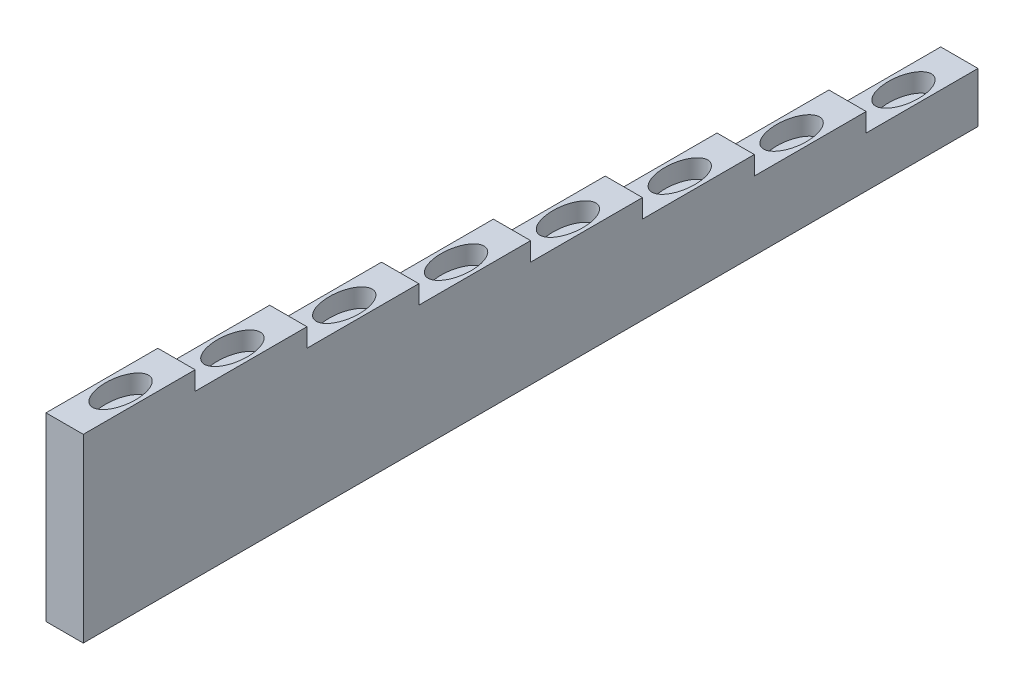
ISO-10303-21;
HEADER;
FILE_DESCRIPTION(('STEP AP214'),'2;1');
FILE_NAME('part.step','',(''),(''),'','','');
FILE_SCHEMA(('AUTOMOTIVE_DESIGN { 1 0 10303 214 1 1 1 1 }'));
ENDSEC;
DATA;
#1=APPLICATION_CONTEXT('core data for automotive mechanical design processes');
#2=APPLICATION_PROTOCOL_DEFINITION('international standard','automotive_design',2000,#1);
#3=PRODUCT_CONTEXT('',#1,'mechanical');
#4=PRODUCT('Part','Part','',(#3));
#5=PRODUCT_RELATED_PRODUCT_CATEGORY('part','',(#4));
#6=PRODUCT_DEFINITION_FORMATION('','',#4);
#7=PRODUCT_DEFINITION_CONTEXT('part definition',#1,'design');
#8=PRODUCT_DEFINITION('design','',#6,#7);
#9=PRODUCT_DEFINITION_SHAPE('','',#8);
#10=(LENGTH_UNIT() NAMED_UNIT(*) SI_UNIT(.MILLI.,.METRE.));
#11=(NAMED_UNIT(*) PLANE_ANGLE_UNIT() SI_UNIT($,.RADIAN.));
#12=(NAMED_UNIT(*) SI_UNIT($,.STERADIAN.) SOLID_ANGLE_UNIT());
#13=UNCERTAINTY_MEASURE_WITH_UNIT(LENGTH_MEASURE(1.E-05),#10,'distance_accuracy_value','');
#14=(GEOMETRIC_REPRESENTATION_CONTEXT(3) GLOBAL_UNCERTAINTY_ASSIGNED_CONTEXT((#13)) GLOBAL_UNIT_ASSIGNED_CONTEXT((#10,
#11,#12)) REPRESENTATION_CONTEXT('',''));
#15=CARTESIAN_POINT('',(0.,0.,0.));
#16=DIRECTION('',(0.,0.,1.));
#17=DIRECTION('',(1.,0.,0.));
#18=AXIS2_PLACEMENT_3D('',#15,#16,#17);
#19=CARTESIAN_POINT('',(-7.23,-34.,48.));
#20=DIRECTION('',(0.,1.,0.));
#21=DIRECTION('',(0.,0.,1.));
#22=AXIS2_PLACEMENT_3D('',#19,#20,#21);
#23=PLANE('',#22);
#24=DIRECTION('',(1.,0.,0.));
#25=VECTOR('',#24,1.);
#26=CARTESIAN_POINT('',(-7.23,-34.,0.));
#27=LINE('',#26,#25);
#28=CARTESIAN_POINT('',(-9.23,-34.,0.));
#29=VERTEX_POINT('',#28);
#30=CARTESIAN_POINT('',(-7.23,-34.,0.));
#31=VERTEX_POINT('',#30);
#32=EDGE_CURVE('E74',#29,#31,#27,.T.);
#33=ORIENTED_EDGE('',*,*,#32,.T.);
#34=DIRECTION('',(0.,0.,-1.));
#35=VECTOR('',#34,1.);
#36=CARTESIAN_POINT('',(-7.23,-34.,48.));
#37=LINE('',#36,#35);
#38=CARTESIAN_POINT('',(-7.23,-34.,48.));
#39=VERTEX_POINT('',#38);
#40=EDGE_CURVE('E43',#39,#31,#37,.T.);
#41=ORIENTED_EDGE('',*,*,#40,.F.);
#42=DIRECTION('',(1.,0.,0.));
#43=VECTOR('',#42,1.);
#44=CARTESIAN_POINT('',(-7.23,-34.,48.));
#45=LINE('',#44,#43);
#46=CARTESIAN_POINT('',(-9.23,-34.,48.));
#47=VERTEX_POINT('',#46);
#48=EDGE_CURVE('E86',#47,#39,#45,.T.);
#49=ORIENTED_EDGE('',*,*,#48,.F.);
#50=DIRECTION('',(0.,0.,-1.));
#51=VECTOR('',#50,1.);
#52=CARTESIAN_POINT('',(-9.23,-34.,48.));
#53=LINE('',#52,#51);
#54=EDGE_CURVE('E11',#47,#29,#53,.T.);
#55=ORIENTED_EDGE('',*,*,#54,.T.);
#56=EDGE_LOOP('',(#33,#41,#49,#55));
#57=FACE_BOUND('',#56,.T.);
#58=ADVANCED_FACE('F34',(#57),#23,.F.);
#59=CARTESIAN_POINT('',(0.,0.,0.));
#60=DIRECTION('',(0.,0.,-1.));
#61=DIRECTION('',(-1.,0.,0.));
#62=AXIS2_PLACEMENT_3D('',#59,#60,#61);
#63=PLANE('',#62);
#64=DIRECTION('',(1.,0.,0.));
#65=VECTOR('',#64,1.);
#66=CARTESIAN_POINT('',(-9.23,-31.3,0.));
#67=LINE('',#66,#65);
#68=CARTESIAN_POINT('',(-9.23,-31.3,0.));
#69=VERTEX_POINT('',#68);
#70=CARTESIAN_POINT('',(-7.23,-31.3,0.));
#71=VERTEX_POINT('',#70);
#72=EDGE_CURVE('E89',#69,#71,#67,.T.);
#73=ORIENTED_EDGE('',*,*,#72,.T.);
#74=DIRECTION('',(0.,1.,0.));
#75=VECTOR('',#74,1.);
#76=CARTESIAN_POINT('',(-7.23,-20.3,0.));
#77=LINE('',#76,#75);
#78=EDGE_CURVE('E80',#31,#71,#77,.T.);
#79=ORIENTED_EDGE('',*,*,#78,.F.);
#80=ORIENTED_EDGE('',*,*,#32,.F.);
#81=DIRECTION('',(0.,-1.,0.));
#82=VECTOR('',#81,1.);
#83=CARTESIAN_POINT('',(-9.23,-34.,0.));
#84=LINE('',#83,#82);
#85=EDGE_CURVE('E81',#69,#29,#84,.T.);
#86=ORIENTED_EDGE('',*,*,#85,.F.);
#87=EDGE_LOOP('',(#73,#79,#80,#86));
#88=FACE_BOUND('',#87,.T.);
#89=ADVANCED_FACE('F88',(#88),#63,.T.);
#90=CARTESIAN_POINT('',(0.,0.,48.));
#91=DIRECTION('',(0.,0.,-1.));
#92=DIRECTION('',(-1.,0.,0.));
#93=AXIS2_PLACEMENT_3D('',#90,#91,#92);
#94=PLANE('',#93);
#95=DIRECTION('',(0.,1.,0.));
#96=VECTOR('',#95,1.);
#97=CARTESIAN_POINT('',(-7.23000000000001,-2.00000000000001,48.));
#98=LINE('',#97,#96);
#99=CARTESIAN_POINT('',(-7.23,-24.3,48.));
#100=VERTEX_POINT('',#99);
#101=EDGE_CURVE('E60',#39,#100,#98,.T.);
#102=ORIENTED_EDGE('',*,*,#101,.T.);
#103=DIRECTION('',(1.,0.,0.));
#104=VECTOR('',#103,1.);
#105=CARTESIAN_POINT('',(-9.23,-24.3,48.));
#106=LINE('',#105,#104);
#107=CARTESIAN_POINT('',(-9.23,-24.3,48.));
#108=VERTEX_POINT('',#107);
#109=EDGE_CURVE('E575',#108,#100,#106,.T.);
#110=ORIENTED_EDGE('',*,*,#109,.F.);
#111=DIRECTION('',(0.,-1.,0.));
#112=VECTOR('',#111,1.);
#113=CARTESIAN_POINT('',(-9.23,-34.,48.));
#114=LINE('',#113,#112);
#115=EDGE_CURVE('E91',#108,#47,#114,.T.);
#116=ORIENTED_EDGE('',*,*,#115,.T.);
#117=ORIENTED_EDGE('',*,*,#48,.T.);
#118=EDGE_LOOP('',(#102,#110,#116,#117));
#119=FACE_BOUND('',#118,.T.);
#120=ADVANCED_FACE('F270',(#119),#94,.F.);
#121=CARTESIAN_POINT('',(-7.23,-20.3,48.));
#122=DIRECTION('',(-1.,0.,0.));
#123=DIRECTION('',(0.,-1.,0.));
#124=AXIS2_PLACEMENT_3D('',#121,#122,#123);
#125=PLANE('',#124);
#126=DIRECTION('',(0.,-1.,0.));
#127=VECTOR('',#126,1.);
#128=CARTESIAN_POINT('',(-7.23,-24.3,42.));
#129=LINE('',#128,#127);
#130=CARTESIAN_POINT('',(-7.23,-24.3,42.));
#131=VERTEX_POINT('',#130);
#132=CARTESIAN_POINT('',(-7.23,-25.3,42.));
#133=VERTEX_POINT('',#132);
#134=EDGE_CURVE('E566',#131,#133,#129,.T.);
#135=ORIENTED_EDGE('',*,*,#134,.F.);
#136=DIRECTION('',(0.,0.,-1.));
#137=VECTOR('',#136,1.);
#138=CARTESIAN_POINT('',(-7.23,-24.3,48.));
#139=LINE('',#138,#137);
#140=EDGE_CURVE('E563',#100,#131,#139,.T.);
#141=ORIENTED_EDGE('',*,*,#140,.F.);
#142=ORIENTED_EDGE('',*,*,#101,.F.);
#143=ORIENTED_EDGE('',*,*,#40,.T.);
#144=ORIENTED_EDGE('',*,*,#78,.T.);
#145=DIRECTION('',(0.,0.,-1.));
#146=VECTOR('',#145,1.);
#147=CARTESIAN_POINT('',(-7.23,-31.3,6.00000000000001));
#148=LINE('',#147,#146);
#149=CARTESIAN_POINT('',(-7.23,-31.3,6.00000000000001));
#150=VERTEX_POINT('',#149);
#151=EDGE_CURVE('E51',#150,#71,#148,.T.);
#152=ORIENTED_EDGE('',*,*,#151,.F.);
#153=DIRECTION('',(0.,-1.,0.));
#154=VECTOR('',#153,1.);
#155=CARTESIAN_POINT('',(-7.23,-30.3,6.00000000000001));
#156=LINE('',#155,#154);
#157=CARTESIAN_POINT('',(-7.23,-30.3,6.00000000000001));
#158=VERTEX_POINT('',#157);
#159=EDGE_CURVE('E559',#158,#150,#156,.T.);
#160=ORIENTED_EDGE('',*,*,#159,.F.);
#161=DIRECTION('',(0.,0.,-1.));
#162=VECTOR('',#161,1.);
#163=CARTESIAN_POINT('',(-7.23,-30.3,12.));
#164=LINE('',#163,#162);
#165=CARTESIAN_POINT('',(-7.23,-30.3,12.));
#166=VERTEX_POINT('',#165);
#167=EDGE_CURVE('E556',#166,#158,#164,.T.);
#168=ORIENTED_EDGE('',*,*,#167,.F.);
#169=DIRECTION('',(0.,-1.,0.));
#170=VECTOR('',#169,1.);
#171=CARTESIAN_POINT('',(-7.23,-29.3,12.));
#172=LINE('',#171,#170);
#173=CARTESIAN_POINT('',(-7.23,-29.3,12.));
#174=VERTEX_POINT('',#173);
#175=EDGE_CURVE('E550',#174,#166,#172,.T.);
#176=ORIENTED_EDGE('',*,*,#175,.F.);
#177=DIRECTION('',(0.,0.,-1.));
#178=VECTOR('',#177,1.);
#179=CARTESIAN_POINT('',(-7.23,-29.3,18.));
#180=LINE('',#179,#178);
#181=CARTESIAN_POINT('',(-7.23,-29.3,18.));
#182=VERTEX_POINT('',#181);
#183=EDGE_CURVE('E547',#182,#174,#180,.T.);
#184=ORIENTED_EDGE('',*,*,#183,.F.);
#185=DIRECTION('',(0.,-1.,0.));
#186=VECTOR('',#185,1.);
#187=CARTESIAN_POINT('',(-7.23,-28.3,18.));
#188=LINE('',#187,#186);
#189=CARTESIAN_POINT('',(-7.23,-28.3,18.));
#190=VERTEX_POINT('',#189);
#191=EDGE_CURVE('E540',#190,#182,#188,.T.);
#192=ORIENTED_EDGE('',*,*,#191,.F.);
#193=DIRECTION('',(0.,0.,-1.));
#194=VECTOR('',#193,1.);
#195=CARTESIAN_POINT('',(-7.23,-28.3,24.));
#196=LINE('',#195,#194);
#197=CARTESIAN_POINT('',(-7.23,-28.3,24.));
#198=VERTEX_POINT('',#197);
#199=EDGE_CURVE('E526',#198,#190,#196,.T.);
#200=ORIENTED_EDGE('',*,*,#199,.F.);
#201=DIRECTION('',(0.,-1.,0.));
#202=VECTOR('',#201,1.);
#203=CARTESIAN_POINT('',(-7.23,-27.3,24.));
#204=LINE('',#203,#202);
#205=CARTESIAN_POINT('',(-7.23,-27.3,24.));
#206=VERTEX_POINT('',#205);
#207=EDGE_CURVE('E541',#206,#198,#204,.T.);
#208=ORIENTED_EDGE('',*,*,#207,.F.);
#209=DIRECTION('',(0.,0.,-1.));
#210=VECTOR('',#209,1.);
#211=CARTESIAN_POINT('',(-7.23,-27.3,30.));
#212=LINE('',#211,#210);
#213=CARTESIAN_POINT('',(-7.23,-27.3,30.));
#214=VERTEX_POINT('',#213);
#215=EDGE_CURVE('E722',#214,#206,#212,.T.);
#216=ORIENTED_EDGE('',*,*,#215,.F.);
#217=DIRECTION('',(0.,-1.,0.));
#218=VECTOR('',#217,1.);
#219=CARTESIAN_POINT('',(-7.23,-26.3,30.));
#220=LINE('',#219,#218);
#221=CARTESIAN_POINT('',(-7.23,-26.3,30.));
#222=VERTEX_POINT('',#221);
#223=EDGE_CURVE('E719',#222,#214,#220,.T.);
#224=ORIENTED_EDGE('',*,*,#223,.F.);
#225=DIRECTION('',(0.,0.,-1.));
#226=VECTOR('',#225,1.);
#227=CARTESIAN_POINT('',(-7.23,-26.3,36.));
#228=LINE('',#227,#226);
#229=CARTESIAN_POINT('',(-7.23,-26.3,36.));
#230=VERTEX_POINT('',#229);
#231=EDGE_CURVE('E716',#230,#222,#228,.T.);
#232=ORIENTED_EDGE('',*,*,#231,.F.);
#233=DIRECTION('',(0.,-1.,0.));
#234=VECTOR('',#233,1.);
#235=CARTESIAN_POINT('',(-7.23,-25.3,36.));
#236=LINE('',#235,#234);
#237=CARTESIAN_POINT('',(-7.23,-25.3,36.));
#238=VERTEX_POINT('',#237);
#239=EDGE_CURVE('E713',#238,#230,#236,.T.);
#240=ORIENTED_EDGE('',*,*,#239,.F.);
#241=DIRECTION('',(0.,0.,-1.));
#242=VECTOR('',#241,1.);
#243=CARTESIAN_POINT('',(-7.23,-25.3,42.));
#244=LINE('',#243,#242);
#245=EDGE_CURVE('E98',#133,#238,#244,.T.);
#246=ORIENTED_EDGE('',*,*,#245,.F.);
#247=EDGE_LOOP('',(#135,#141,#142,#143,#144,#152,#160,#168,#176,#184,#192,#200,#208,#216,#224,
#232,#240,#246));
#248=FACE_BOUND('',#247,.T.);
#249=ADVANCED_FACE('F85',(#248),#125,.F.);
#250=CARTESIAN_POINT('',(-9.23,-34.,48.));
#251=DIRECTION('',(1.,0.,0.));
#252=DIRECTION('',(0.,1.,0.));
#253=AXIS2_PLACEMENT_3D('',#250,#251,#252);
#254=PLANE('',#253);
#255=ORIENTED_EDGE('',*,*,#115,.F.);
#256=DIRECTION('',(0.,0.,-1.));
#257=VECTOR('',#256,1.);
#258=CARTESIAN_POINT('',(-9.23,-24.3,48.));
#259=LINE('',#258,#257);
#260=CARTESIAN_POINT('',(-9.23,-24.3,42.));
#261=VERTEX_POINT('',#260);
#262=EDGE_CURVE('E707',#108,#261,#259,.T.);
#263=ORIENTED_EDGE('',*,*,#262,.T.);
#264=DIRECTION('',(0.,-1.,0.));
#265=VECTOR('',#264,1.);
#266=CARTESIAN_POINT('',(-9.23,-24.3,42.));
#267=LINE('',#266,#265);
#268=CARTESIAN_POINT('',(-9.23,-25.3,42.));
#269=VERTEX_POINT('',#268);
#270=EDGE_CURVE('E609',#261,#269,#267,.T.);
#271=ORIENTED_EDGE('',*,*,#270,.T.);
#272=DIRECTION('',(0.,0.,-1.));
#273=VECTOR('',#272,1.);
#274=CARTESIAN_POINT('',(-9.23,-25.3,42.));
#275=LINE('',#274,#273);
#276=CARTESIAN_POINT('',(-9.23,-25.3,36.));
#277=VERTEX_POINT('',#276);
#278=EDGE_CURVE('E204',#269,#277,#275,.T.);
#279=ORIENTED_EDGE('',*,*,#278,.T.);
#280=DIRECTION('',(0.,-1.,0.));
#281=VECTOR('',#280,1.);
#282=CARTESIAN_POINT('',(-9.23,-25.3,36.));
#283=LINE('',#282,#281);
#284=CARTESIAN_POINT('',(-9.23,-26.3,36.));
#285=VERTEX_POINT('',#284);
#286=EDGE_CURVE('E741',#277,#285,#283,.T.);
#287=ORIENTED_EDGE('',*,*,#286,.T.);
#288=DIRECTION('',(0.,0.,-1.));
#289=VECTOR('',#288,1.);
#290=CARTESIAN_POINT('',(-9.23,-26.3,36.));
#291=LINE('',#290,#289);
#292=CARTESIAN_POINT('',(-9.23,-26.3,30.));
#293=VERTEX_POINT('',#292);
#294=EDGE_CURVE('E743',#285,#293,#291,.T.);
#295=ORIENTED_EDGE('',*,*,#294,.T.);
#296=DIRECTION('',(0.,-1.,0.));
#297=VECTOR('',#296,1.);
#298=CARTESIAN_POINT('',(-9.23,-26.3,30.));
#299=LINE('',#298,#297);
#300=CARTESIAN_POINT('',(-9.23,-27.3,30.));
#301=VERTEX_POINT('',#300);
#302=EDGE_CURVE('E734',#293,#301,#299,.T.);
#303=ORIENTED_EDGE('',*,*,#302,.T.);
#304=DIRECTION('',(0.,0.,-1.));
#305=VECTOR('',#304,1.);
#306=CARTESIAN_POINT('',(-9.23,-27.3,30.));
#307=LINE('',#306,#305);
#308=CARTESIAN_POINT('',(-9.23,-27.3,24.));
#309=VERTEX_POINT('',#308);
#310=EDGE_CURVE('E731',#301,#309,#307,.T.);
#311=ORIENTED_EDGE('',*,*,#310,.T.);
#312=DIRECTION('',(0.,-1.,0.));
#313=VECTOR('',#312,1.);
#314=CARTESIAN_POINT('',(-9.23,-27.3,24.));
#315=LINE('',#314,#313);
#316=CARTESIAN_POINT('',(-9.23,-28.3,24.));
#317=VERTEX_POINT('',#316);
#318=EDGE_CURVE('E751',#309,#317,#315,.T.);
#319=ORIENTED_EDGE('',*,*,#318,.T.);
#320=DIRECTION('',(0.,0.,-1.));
#321=VECTOR('',#320,1.);
#322=CARTESIAN_POINT('',(-9.23,-28.3,24.));
#323=LINE('',#322,#321);
#324=CARTESIAN_POINT('',(-9.23,-28.3,18.));
#325=VERTEX_POINT('',#324);
#326=EDGE_CURVE('E754',#317,#325,#323,.T.);
#327=ORIENTED_EDGE('',*,*,#326,.T.);
#328=DIRECTION('',(0.,-1.,0.));
#329=VECTOR('',#328,1.);
#330=CARTESIAN_POINT('',(-9.23,-28.3,18.));
#331=LINE('',#330,#329);
#332=CARTESIAN_POINT('',(-9.23,-29.3,18.));
#333=VERTEX_POINT('',#332);
#334=EDGE_CURVE('E757',#325,#333,#331,.T.);
#335=ORIENTED_EDGE('',*,*,#334,.T.);
#336=DIRECTION('',(0.,0.,-1.));
#337=VECTOR('',#336,1.);
#338=CARTESIAN_POINT('',(-9.23,-29.3,18.));
#339=LINE('',#338,#337);
#340=CARTESIAN_POINT('',(-9.23,-29.3,12.));
#341=VERTEX_POINT('',#340);
#342=EDGE_CURVE('E702',#333,#341,#339,.T.);
#343=ORIENTED_EDGE('',*,*,#342,.T.);
#344=DIRECTION('',(0.,-1.,0.));
#345=VECTOR('',#344,1.);
#346=CARTESIAN_POINT('',(-9.23,-29.3,12.));
#347=LINE('',#346,#345);
#348=CARTESIAN_POINT('',(-9.23,-30.3,12.));
#349=VERTEX_POINT('',#348);
#350=EDGE_CURVE('E700',#341,#349,#347,.T.);
#351=ORIENTED_EDGE('',*,*,#350,.T.);
#352=DIRECTION('',(0.,0.,-1.));
#353=VECTOR('',#352,1.);
#354=CARTESIAN_POINT('',(-9.23,-30.3,12.));
#355=LINE('',#354,#353);
#356=CARTESIAN_POINT('',(-9.23,-30.3,6.00000000000001));
#357=VERTEX_POINT('',#356);
#358=EDGE_CURVE('E692',#349,#357,#355,.T.);
#359=ORIENTED_EDGE('',*,*,#358,.T.);
#360=DIRECTION('',(0.,-1.,0.));
#361=VECTOR('',#360,1.);
#362=CARTESIAN_POINT('',(-9.23,-30.3,6.00000000000001));
#363=LINE('',#362,#361);
#364=CARTESIAN_POINT('',(-9.23,-31.3,6.00000000000001));
#365=VERTEX_POINT('',#364);
#366=EDGE_CURVE('E696',#357,#365,#363,.T.);
#367=ORIENTED_EDGE('',*,*,#366,.T.);
#368=DIRECTION('',(0.,0.,-1.));
#369=VECTOR('',#368,1.);
#370=CARTESIAN_POINT('',(-9.23,-31.3,6.00000000000001));
#371=LINE('',#370,#369);
#372=EDGE_CURVE('E617',#365,#69,#371,.T.);
#373=ORIENTED_EDGE('',*,*,#372,.T.);
#374=ORIENTED_EDGE('',*,*,#85,.T.);
#375=ORIENTED_EDGE('',*,*,#54,.F.);
#376=EDGE_LOOP('',(#255,#263,#271,#279,#287,#295,#303,#311,#319,#327,#335,#343,#351,#359,#367,
#373,#374,#375));
#377=FACE_BOUND('',#376,.T.);
#378=ADVANCED_FACE('F36',(#377),#254,.F.);
#379=CARTESIAN_POINT('',(-9.23,-31.3,6.00000000000001));
#380=DIRECTION('',(0.,-1.,0.));
#381=DIRECTION('',(1.,0.,0.));
#382=AXIS2_PLACEMENT_3D('',#379,#380,#381);
#383=PLANE('',#382);
#384=CARTESIAN_POINT('',(-8.23,-31.3,3.));
#385=DIRECTION('',(0.,1.,0.));
#386=DIRECTION('',(0.,0.,-1.));
#387=AXIS2_PLACEMENT_3D('',#384,#385,#386);
#388=ELLIPSE('',#387,1.5,0.8);
#389=CARTESIAN_POINT('',(-8.23,-31.3,1.5));
#390=VERTEX_POINT('',#389);
#391=EDGE_CURVE('E38',#390,#390,#388,.T.);
#392=ORIENTED_EDGE('',*,*,#391,.F.);
#393=EDGE_LOOP('',(#392));
#394=FACE_BOUND('',#393,.T.);
#395=ORIENTED_EDGE('',*,*,#151,.T.);
#396=ORIENTED_EDGE('',*,*,#72,.F.);
#397=ORIENTED_EDGE('',*,*,#372,.F.);
#398=DIRECTION('',(1.,0.,0.));
#399=VECTOR('',#398,1.);
#400=CARTESIAN_POINT('',(-9.23,-31.3,6.00000000000001));
#401=LINE('',#400,#399);
#402=EDGE_CURVE('E579',#365,#150,#401,.T.);
#403=ORIENTED_EDGE('',*,*,#402,.T.);
#404=EDGE_LOOP('',(#395,#396,#397,#403));
#405=FACE_BOUND('',#404,.T.);
#406=ADVANCED_FACE('F220',(#394,#405),#383,.F.);
#407=CARTESIAN_POINT('',(-9.23,-25.3,36.));
#408=DIRECTION('',(0.,0.,1.));
#409=DIRECTION('',(1.,0.,0.));
#410=AXIS2_PLACEMENT_3D('',#407,#408,#409);
#411=PLANE('',#410);
#412=ORIENTED_EDGE('',*,*,#239,.T.);
#413=DIRECTION('',(1.,0.,0.));
#414=VECTOR('',#413,1.);
#415=CARTESIAN_POINT('',(-9.23,-26.3,36.));
#416=LINE('',#415,#414);
#417=EDGE_CURVE('E604',#285,#230,#416,.T.);
#418=ORIENTED_EDGE('',*,*,#417,.F.);
#419=ORIENTED_EDGE('',*,*,#286,.F.);
#420=DIRECTION('',(1.,0.,0.));
#421=VECTOR('',#420,1.);
#422=CARTESIAN_POINT('',(-9.23,-25.3,36.));
#423=LINE('',#422,#421);
#424=EDGE_CURVE('E607',#277,#238,#423,.T.);
#425=ORIENTED_EDGE('',*,*,#424,.T.);
#426=EDGE_LOOP('',(#412,#418,#419,#425));
#427=FACE_BOUND('',#426,.T.);
#428=ADVANCED_FACE('F223',(#427),#411,.F.);
#429=CARTESIAN_POINT('',(-9.23,-26.3,36.));
#430=DIRECTION('',(0.,-1.,0.));
#431=DIRECTION('',(1.,0.,0.));
#432=AXIS2_PLACEMENT_3D('',#429,#430,#431);
#433=PLANE('',#432);
#434=CARTESIAN_POINT('',(-8.23,-26.3,33.));
#435=DIRECTION('',(0.,1.,0.));
#436=DIRECTION('',(0.,0.,-1.));
#437=AXIS2_PLACEMENT_3D('',#434,#435,#436);
#438=ELLIPSE('',#437,1.5,0.8);
#439=CARTESIAN_POINT('',(-8.23,-26.3,31.5));
#440=VERTEX_POINT('',#439);
#441=EDGE_CURVE('E104',#440,#440,#438,.T.);
#442=ORIENTED_EDGE('',*,*,#441,.F.);
#443=EDGE_LOOP('',(#442));
#444=FACE_BOUND('',#443,.T.);
#445=ORIENTED_EDGE('',*,*,#231,.T.);
#446=DIRECTION('',(1.,0.,0.));
#447=VECTOR('',#446,1.);
#448=CARTESIAN_POINT('',(-9.23,-26.3,30.));
#449=LINE('',#448,#447);
#450=EDGE_CURVE('E601',#293,#222,#449,.T.);
#451=ORIENTED_EDGE('',*,*,#450,.F.);
#452=ORIENTED_EDGE('',*,*,#294,.F.);
#453=ORIENTED_EDGE('',*,*,#417,.T.);
#454=EDGE_LOOP('',(#445,#451,#452,#453));
#455=FACE_BOUND('',#454,.T.);
#456=ADVANCED_FACE('F259',(#444,#455),#433,.F.);
#457=CARTESIAN_POINT('',(-9.23,-26.3,30.));
#458=DIRECTION('',(0.,0.,1.));
#459=DIRECTION('',(1.,0.,0.));
#460=AXIS2_PLACEMENT_3D('',#457,#458,#459);
#461=PLANE('',#460);
#462=ORIENTED_EDGE('',*,*,#223,.T.);
#463=DIRECTION('',(1.,0.,0.));
#464=VECTOR('',#463,1.);
#465=CARTESIAN_POINT('',(-9.23,-27.3,30.));
#466=LINE('',#465,#464);
#467=EDGE_CURVE('E598',#301,#214,#466,.T.);
#468=ORIENTED_EDGE('',*,*,#467,.F.);
#469=ORIENTED_EDGE('',*,*,#302,.F.);
#470=ORIENTED_EDGE('',*,*,#450,.T.);
#471=EDGE_LOOP('',(#462,#468,#469,#470));
#472=FACE_BOUND('',#471,.T.);
#473=ADVANCED_FACE('F255',(#472),#461,.F.);
#474=CARTESIAN_POINT('',(-9.23,-27.3,30.));
#475=DIRECTION('',(0.,-1.,0.));
#476=DIRECTION('',(1.,0.,0.));
#477=AXIS2_PLACEMENT_3D('',#474,#475,#476);
#478=PLANE('',#477);
#479=CARTESIAN_POINT('',(-8.23,-27.3,27.));
#480=DIRECTION('',(0.,1.,0.));
#481=DIRECTION('',(0.,0.,-1.));
#482=AXIS2_PLACEMENT_3D('',#479,#480,#481);
#483=ELLIPSE('',#482,1.5,0.8);
#484=CARTESIAN_POINT('',(-8.23,-27.3,25.5));
#485=VERTEX_POINT('',#484);
#486=EDGE_CURVE('E108',#485,#485,#483,.T.);
#487=ORIENTED_EDGE('',*,*,#486,.F.);
#488=EDGE_LOOP('',(#487));
#489=FACE_BOUND('',#488,.T.);
#490=ORIENTED_EDGE('',*,*,#215,.T.);
#491=DIRECTION('',(1.,0.,0.));
#492=VECTOR('',#491,1.);
#493=CARTESIAN_POINT('',(-9.23,-27.3,24.));
#494=LINE('',#493,#492);
#495=EDGE_CURVE('E595',#309,#206,#494,.T.);
#496=ORIENTED_EDGE('',*,*,#495,.F.);
#497=ORIENTED_EDGE('',*,*,#310,.F.);
#498=ORIENTED_EDGE('',*,*,#467,.T.);
#499=EDGE_LOOP('',(#490,#496,#497,#498));
#500=FACE_BOUND('',#499,.T.);
#501=ADVANCED_FACE('F251',(#489,#500),#478,.F.);
#502=CARTESIAN_POINT('',(-9.23,-27.3,24.));
#503=DIRECTION('',(0.,0.,1.));
#504=DIRECTION('',(1.,0.,0.));
#505=AXIS2_PLACEMENT_3D('',#502,#503,#504);
#506=PLANE('',#505);
#507=ORIENTED_EDGE('',*,*,#207,.T.);
#508=DIRECTION('',(1.,0.,0.));
#509=VECTOR('',#508,1.);
#510=CARTESIAN_POINT('',(-9.23,-28.3,24.));
#511=LINE('',#510,#509);
#512=EDGE_CURVE('E535',#317,#198,#511,.T.);
#513=ORIENTED_EDGE('',*,*,#512,.F.);
#514=ORIENTED_EDGE('',*,*,#318,.F.);
#515=ORIENTED_EDGE('',*,*,#495,.T.);
#516=EDGE_LOOP('',(#507,#513,#514,#515));
#517=FACE_BOUND('',#516,.T.);
#518=ADVANCED_FACE('F247',(#517),#506,.F.);
#519=CARTESIAN_POINT('',(-9.23,-28.3,24.));
#520=DIRECTION('',(0.,-1.,0.));
#521=DIRECTION('',(1.,0.,0.));
#522=AXIS2_PLACEMENT_3D('',#519,#520,#521);
#523=PLANE('',#522);
#524=CARTESIAN_POINT('',(-8.23,-28.3,21.));
#525=DIRECTION('',(0.,1.,0.));
#526=DIRECTION('',(0.,0.,-1.));
#527=AXIS2_PLACEMENT_3D('',#524,#525,#526);
#528=ELLIPSE('',#527,1.5,0.8);
#529=CARTESIAN_POINT('',(-8.23,-28.3,19.5));
#530=VERTEX_POINT('',#529);
#531=EDGE_CURVE('E112',#530,#530,#528,.T.);
#532=ORIENTED_EDGE('',*,*,#531,.F.);
#533=EDGE_LOOP('',(#532));
#534=FACE_BOUND('',#533,.T.);
#535=ORIENTED_EDGE('',*,*,#199,.T.);
#536=DIRECTION('',(1.,0.,0.));
#537=VECTOR('',#536,1.);
#538=CARTESIAN_POINT('',(-9.23,-28.3,18.));
#539=LINE('',#538,#537);
#540=EDGE_CURVE('E531',#325,#190,#539,.T.);
#541=ORIENTED_EDGE('',*,*,#540,.F.);
#542=ORIENTED_EDGE('',*,*,#326,.F.);
#543=ORIENTED_EDGE('',*,*,#512,.T.);
#544=EDGE_LOOP('',(#535,#541,#542,#543));
#545=FACE_BOUND('',#544,.T.);
#546=ADVANCED_FACE('F243',(#534,#545),#523,.F.);
#547=CARTESIAN_POINT('',(-9.23,-28.3,18.));
#548=DIRECTION('',(0.,0.,1.));
#549=DIRECTION('',(1.,0.,0.));
#550=AXIS2_PLACEMENT_3D('',#547,#548,#549);
#551=PLANE('',#550);
#552=ORIENTED_EDGE('',*,*,#191,.T.);
#553=DIRECTION('',(1.,0.,0.));
#554=VECTOR('',#553,1.);
#555=CARTESIAN_POINT('',(-9.23,-29.3,18.));
#556=LINE('',#555,#554);
#557=EDGE_CURVE('E590',#333,#182,#556,.T.);
#558=ORIENTED_EDGE('',*,*,#557,.F.);
#559=ORIENTED_EDGE('',*,*,#334,.F.);
#560=ORIENTED_EDGE('',*,*,#540,.T.);
#561=EDGE_LOOP('',(#552,#558,#559,#560));
#562=FACE_BOUND('',#561,.T.);
#563=ADVANCED_FACE('F239',(#562),#551,.F.);
#564=CARTESIAN_POINT('',(-9.23,-29.3,18.));
#565=DIRECTION('',(0.,-1.,0.));
#566=DIRECTION('',(1.,0.,0.));
#567=AXIS2_PLACEMENT_3D('',#564,#565,#566);
#568=PLANE('',#567);
#569=CARTESIAN_POINT('',(-8.23,-29.3,15.));
#570=DIRECTION('',(0.,1.,0.));
#571=DIRECTION('',(0.,0.,-1.));
#572=AXIS2_PLACEMENT_3D('',#569,#570,#571);
#573=ELLIPSE('',#572,1.5,0.8);
#574=CARTESIAN_POINT('',(-8.23,-29.3,13.5));
#575=VERTEX_POINT('',#574);
#576=EDGE_CURVE('E116',#575,#575,#573,.T.);
#577=ORIENTED_EDGE('',*,*,#576,.F.);
#578=EDGE_LOOP('',(#577));
#579=FACE_BOUND('',#578,.T.);
#580=ORIENTED_EDGE('',*,*,#183,.T.);
#581=DIRECTION('',(1.,0.,0.));
#582=VECTOR('',#581,1.);
#583=CARTESIAN_POINT('',(-9.23,-29.3,12.));
#584=LINE('',#583,#582);
#585=EDGE_CURVE('E587',#341,#174,#584,.T.);
#586=ORIENTED_EDGE('',*,*,#585,.F.);
#587=ORIENTED_EDGE('',*,*,#342,.F.);
#588=ORIENTED_EDGE('',*,*,#557,.T.);
#589=EDGE_LOOP('',(#580,#586,#587,#588));
#590=FACE_BOUND('',#589,.T.);
#591=ADVANCED_FACE('F235',(#579,#590),#568,.F.);
#592=CARTESIAN_POINT('',(-9.23,-29.3,12.));
#593=DIRECTION('',(0.,0.,1.));
#594=DIRECTION('',(1.,0.,0.));
#595=AXIS2_PLACEMENT_3D('',#592,#593,#594);
#596=PLANE('',#595);
#597=ORIENTED_EDGE('',*,*,#175,.T.);
#598=DIRECTION('',(1.,0.,0.));
#599=VECTOR('',#598,1.);
#600=CARTESIAN_POINT('',(-9.23,-30.3,12.));
#601=LINE('',#600,#599);
#602=EDGE_CURVE('E584',#349,#166,#601,.T.);
#603=ORIENTED_EDGE('',*,*,#602,.F.);
#604=ORIENTED_EDGE('',*,*,#350,.F.);
#605=ORIENTED_EDGE('',*,*,#585,.T.);
#606=EDGE_LOOP('',(#597,#603,#604,#605));
#607=FACE_BOUND('',#606,.T.);
#608=ADVANCED_FACE('F231',(#607),#596,.F.);
#609=CARTESIAN_POINT('',(-9.23,-30.3,12.));
#610=DIRECTION('',(0.,-1.,0.));
#611=DIRECTION('',(1.,0.,0.));
#612=AXIS2_PLACEMENT_3D('',#609,#610,#611);
#613=PLANE('',#612);
#614=CARTESIAN_POINT('',(-8.23,-30.3,9.00000000000001));
#615=DIRECTION('',(0.,1.,0.));
#616=DIRECTION('',(0.,0.,-1.));
#617=AXIS2_PLACEMENT_3D('',#614,#615,#616);
#618=ELLIPSE('',#617,1.5,0.8);
#619=CARTESIAN_POINT('',(-8.23,-30.3,7.50000000000001));
#620=VERTEX_POINT('',#619);
#621=EDGE_CURVE('E119',#620,#620,#618,.T.);
#622=ORIENTED_EDGE('',*,*,#621,.F.);
#623=EDGE_LOOP('',(#622));
#624=FACE_BOUND('',#623,.T.);
#625=ORIENTED_EDGE('',*,*,#167,.T.);
#626=DIRECTION('',(1.,0.,0.));
#627=VECTOR('',#626,1.);
#628=CARTESIAN_POINT('',(-9.23,-30.3,6.00000000000001));
#629=LINE('',#628,#627);
#630=EDGE_CURVE('E581',#357,#158,#629,.T.);
#631=ORIENTED_EDGE('',*,*,#630,.F.);
#632=ORIENTED_EDGE('',*,*,#358,.F.);
#633=ORIENTED_EDGE('',*,*,#602,.T.);
#634=EDGE_LOOP('',(#625,#631,#632,#633));
#635=FACE_BOUND('',#634,.T.);
#636=ADVANCED_FACE('F227',(#624,#635),#613,.F.);
#637=CARTESIAN_POINT('',(-9.23,-30.3,6.00000000000001));
#638=DIRECTION('',(0.,0.,1.));
#639=DIRECTION('',(0.,-1.,0.));
#640=AXIS2_PLACEMENT_3D('',#637,#638,#639);
#641=PLANE('',#640);
#642=ORIENTED_EDGE('',*,*,#159,.T.);
#643=ORIENTED_EDGE('',*,*,#402,.F.);
#644=ORIENTED_EDGE('',*,*,#366,.F.);
#645=ORIENTED_EDGE('',*,*,#630,.T.);
#646=EDGE_LOOP('',(#642,#643,#644,#645));
#647=FACE_BOUND('',#646,.T.);
#648=ADVANCED_FACE('F218',(#647),#641,.F.);
#649=CARTESIAN_POINT('',(-9.23,-24.3,48.));
#650=DIRECTION('',(0.,-1.,0.));
#651=DIRECTION('',(1.,0.,0.));
#652=AXIS2_PLACEMENT_3D('',#649,#650,#651);
#653=PLANE('',#652);
#654=CARTESIAN_POINT('',(-8.23,-24.3,45.));
#655=DIRECTION('',(0.,1.,0.));
#656=DIRECTION('',(0.,0.,-1.));
#657=AXIS2_PLACEMENT_3D('',#654,#655,#656);
#658=ELLIPSE('',#657,1.5,0.8);
#659=CARTESIAN_POINT('',(-8.23,-24.3,43.5));
#660=VERTEX_POINT('',#659);
#661=EDGE_CURVE('E95',#660,#660,#658,.T.);
#662=ORIENTED_EDGE('',*,*,#661,.F.);
#663=EDGE_LOOP('',(#662));
#664=FACE_BOUND('',#663,.T.);
#665=ORIENTED_EDGE('',*,*,#140,.T.);
#666=DIRECTION('',(1.,0.,0.));
#667=VECTOR('',#666,1.);
#668=CARTESIAN_POINT('',(-9.23,-24.3,42.));
#669=LINE('',#668,#667);
#670=EDGE_CURVE('E572',#261,#131,#669,.T.);
#671=ORIENTED_EDGE('',*,*,#670,.F.);
#672=ORIENTED_EDGE('',*,*,#262,.F.);
#673=ORIENTED_EDGE('',*,*,#109,.T.);
#674=EDGE_LOOP('',(#665,#671,#672,#673));
#675=FACE_BOUND('',#674,.T.);
#676=ADVANCED_FACE('F214',(#664,#675),#653,.F.);
#677=CARTESIAN_POINT('',(-9.23,-24.3,42.));
#678=DIRECTION('',(0.,0.,1.));
#679=DIRECTION('',(1.,0.,0.));
#680=AXIS2_PLACEMENT_3D('',#677,#678,#679);
#681=PLANE('',#680);
#682=ORIENTED_EDGE('',*,*,#134,.T.);
#683=DIRECTION('',(1.,0.,0.));
#684=VECTOR('',#683,1.);
#685=CARTESIAN_POINT('',(-9.23,-25.3,42.));
#686=LINE('',#685,#684);
#687=EDGE_CURVE('E569',#269,#133,#686,.T.);
#688=ORIENTED_EDGE('',*,*,#687,.F.);
#689=ORIENTED_EDGE('',*,*,#270,.F.);
#690=ORIENTED_EDGE('',*,*,#670,.T.);
#691=EDGE_LOOP('',(#682,#688,#689,#690));
#692=FACE_BOUND('',#691,.T.);
#693=ADVANCED_FACE('F211',(#692),#681,.F.);
#694=CARTESIAN_POINT('',(-9.23,-25.3,42.));
#695=DIRECTION('',(0.,-1.,0.));
#696=DIRECTION('',(1.,0.,0.));
#697=AXIS2_PLACEMENT_3D('',#694,#695,#696);
#698=PLANE('',#697);
#699=CARTESIAN_POINT('',(-8.23,-25.3,39.));
#700=DIRECTION('',(0.,1.,0.));
#701=DIRECTION('',(0.,0.,-1.));
#702=AXIS2_PLACEMENT_3D('',#699,#700,#701);
#703=ELLIPSE('',#702,1.5,0.8);
#704=CARTESIAN_POINT('',(-8.23,-25.3,37.5));
#705=VERTEX_POINT('',#704);
#706=EDGE_CURVE('E100',#705,#705,#703,.T.);
#707=ORIENTED_EDGE('',*,*,#706,.F.);
#708=EDGE_LOOP('',(#707));
#709=FACE_BOUND('',#708,.T.);
#710=ORIENTED_EDGE('',*,*,#245,.T.);
#711=ORIENTED_EDGE('',*,*,#424,.F.);
#712=ORIENTED_EDGE('',*,*,#278,.F.);
#713=ORIENTED_EDGE('',*,*,#687,.T.);
#714=EDGE_LOOP('',(#710,#711,#712,#713));
#715=FACE_BOUND('',#714,.T.);
#716=ADVANCED_FACE('F209',(#709,#715),#698,.F.);
#717=CARTESIAN_POINT('',(-8.23,-15.3,45.));
#718=DIRECTION('',(0.,1.,0.));
#719=DIRECTION('',(0.,0.,-1.));
#720=AXIS2_PLACEMENT_3D('',#717,#718,#719);
#721=ELLIPSE('',#720,1.5,0.8);
#722=DIRECTION('',(0.,-1.,0.));
#723=VECTOR('',#722,1.);
#724=SURFACE_OF_LINEAR_EXTRUSION('',#721,#723);
#725=CARTESIAN_POINT('',(-8.23,-25.3,45.));
#726=DIRECTION('',(0.,1.,0.));
#727=DIRECTION('',(0.,0.,-1.));
#728=AXIS2_PLACEMENT_3D('',#725,#726,#727);
#729=ELLIPSE('',#728,1.5,0.8);
#730=CARTESIAN_POINT('',(-8.23,-25.3,43.5));
#731=VERTEX_POINT('',#730);
#732=EDGE_CURVE('E99',#731,#731,#729,.T.);
#733=ORIENTED_EDGE('',*,*,#732,.F.);
#734=EDGE_LOOP('',(#733));
#735=FACE_BOUND('',#734,.T.);
#736=ORIENTED_EDGE('',*,*,#661,.T.);
#737=EDGE_LOOP('',(#736));
#738=FACE_BOUND('',#737,.T.);
#739=ADVANCED_FACE('F206',(#735,#738),#724,.T.);
#740=CARTESIAN_POINT('',(-8.23,-25.3,45.));
#741=DIRECTION('',(0.,1.,0.));
#742=DIRECTION('',(-1.,0.,0.));
#743=AXIS2_PLACEMENT_3D('',#740,#741,#742);
#744=PLANE('',#743);
#745=ORIENTED_EDGE('',*,*,#732,.T.);
#746=EDGE_LOOP('',(#745));
#747=FACE_BOUND('',#746,.T.);
#748=ADVANCED_FACE('F195',(#747),#744,.T.);
#749=CARTESIAN_POINT('',(-8.23,-14.3,39.));
#750=DIRECTION('',(0.,1.,0.));
#751=DIRECTION('',(0.,0.,-1.));
#752=AXIS2_PLACEMENT_3D('',#749,#750,#751);
#753=ELLIPSE('',#752,1.5,0.8);
#754=DIRECTION('',(0.,-1.,0.));
#755=VECTOR('',#754,1.);
#756=SURFACE_OF_LINEAR_EXTRUSION('',#753,#755);
#757=CARTESIAN_POINT('',(-8.23,-26.3,39.));
#758=DIRECTION('',(0.,1.,0.));
#759=DIRECTION('',(0.,0.,-1.));
#760=AXIS2_PLACEMENT_3D('',#757,#758,#759);
#761=ELLIPSE('',#760,1.5,0.8);
#762=CARTESIAN_POINT('',(-8.23,-26.3,37.5));
#763=VERTEX_POINT('',#762);
#764=EDGE_CURVE('E103',#763,#763,#761,.T.);
#765=ORIENTED_EDGE('',*,*,#764,.F.);
#766=EDGE_LOOP('',(#765));
#767=FACE_BOUND('',#766,.T.);
#768=ORIENTED_EDGE('',*,*,#706,.T.);
#769=EDGE_LOOP('',(#768));
#770=FACE_BOUND('',#769,.T.);
#771=ADVANCED_FACE('F191',(#767,#770),#756,.T.);
#772=CARTESIAN_POINT('',(-8.23,-26.3,39.));
#773=DIRECTION('',(0.,1.,0.));
#774=DIRECTION('',(-1.,0.,0.));
#775=AXIS2_PLACEMENT_3D('',#772,#773,#774);
#776=PLANE('',#775);
#777=ORIENTED_EDGE('',*,*,#764,.T.);
#778=EDGE_LOOP('',(#777));
#779=FACE_BOUND('',#778,.T.);
#780=ADVANCED_FACE('F187',(#779),#776,.T.);
#781=CARTESIAN_POINT('',(-8.23,-13.3,33.));
#782=DIRECTION('',(0.,1.,0.));
#783=DIRECTION('',(0.,0.,-1.));
#784=AXIS2_PLACEMENT_3D('',#781,#782,#783);
#785=ELLIPSE('',#784,1.5,0.8);
#786=DIRECTION('',(0.,-1.,0.));
#787=VECTOR('',#786,1.);
#788=SURFACE_OF_LINEAR_EXTRUSION('',#785,#787);
#789=CARTESIAN_POINT('',(-8.23,-27.3,33.));
#790=DIRECTION('',(0.,1.,0.));
#791=DIRECTION('',(0.,0.,-1.));
#792=AXIS2_PLACEMENT_3D('',#789,#790,#791);
#793=ELLIPSE('',#792,1.5,0.8);
#794=CARTESIAN_POINT('',(-8.23,-27.3,31.5));
#795=VERTEX_POINT('',#794);
#796=EDGE_CURVE('E107',#795,#795,#793,.T.);
#797=ORIENTED_EDGE('',*,*,#796,.F.);
#798=EDGE_LOOP('',(#797));
#799=FACE_BOUND('',#798,.T.);
#800=ORIENTED_EDGE('',*,*,#441,.T.);
#801=EDGE_LOOP('',(#800));
#802=FACE_BOUND('',#801,.T.);
#803=ADVANCED_FACE('F184',(#799,#802),#788,.T.);
#804=CARTESIAN_POINT('',(-8.23,-27.3,33.));
#805=DIRECTION('',(0.,1.,0.));
#806=DIRECTION('',(-1.,0.,0.));
#807=AXIS2_PLACEMENT_3D('',#804,#805,#806);
#808=PLANE('',#807);
#809=ORIENTED_EDGE('',*,*,#796,.T.);
#810=EDGE_LOOP('',(#809));
#811=FACE_BOUND('',#810,.T.);
#812=ADVANCED_FACE('F174',(#811),#808,.T.);
#813=CARTESIAN_POINT('',(-8.23,-12.3,27.));
#814=DIRECTION('',(0.,1.,0.));
#815=DIRECTION('',(0.,0.,-1.));
#816=AXIS2_PLACEMENT_3D('',#813,#814,#815);
#817=ELLIPSE('',#816,1.5,0.8);
#818=DIRECTION('',(0.,-1.,0.));
#819=VECTOR('',#818,1.);
#820=SURFACE_OF_LINEAR_EXTRUSION('',#817,#819);
#821=CARTESIAN_POINT('',(-8.23,-28.3,27.));
#822=DIRECTION('',(0.,1.,0.));
#823=DIRECTION('',(0.,0.,-1.));
#824=AXIS2_PLACEMENT_3D('',#821,#822,#823);
#825=ELLIPSE('',#824,1.5,0.8);
#826=CARTESIAN_POINT('',(-8.23,-28.3,25.5));
#827=VERTEX_POINT('',#826);
#828=EDGE_CURVE('E111',#827,#827,#825,.T.);
#829=ORIENTED_EDGE('',*,*,#828,.F.);
#830=EDGE_LOOP('',(#829));
#831=FACE_BOUND('',#830,.T.);
#832=ORIENTED_EDGE('',*,*,#486,.T.);
#833=EDGE_LOOP('',(#832));
#834=FACE_BOUND('',#833,.T.);
#835=ADVANCED_FACE('F170',(#831,#834),#820,.T.);
#836=CARTESIAN_POINT('',(-8.23,-28.3,27.));
#837=DIRECTION('',(0.,1.,0.));
#838=DIRECTION('',(-1.,0.,0.));
#839=AXIS2_PLACEMENT_3D('',#836,#837,#838);
#840=PLANE('',#839);
#841=ORIENTED_EDGE('',*,*,#828,.T.);
#842=EDGE_LOOP('',(#841));
#843=FACE_BOUND('',#842,.T.);
#844=ADVANCED_FACE('F166',(#843),#840,.T.);
#845=CARTESIAN_POINT('',(-8.23,-11.3,21.));
#846=DIRECTION('',(0.,1.,0.));
#847=DIRECTION('',(0.,0.,-1.));
#848=AXIS2_PLACEMENT_3D('',#845,#846,#847);
#849=ELLIPSE('',#848,1.5,0.8);
#850=DIRECTION('',(0.,-1.,0.));
#851=VECTOR('',#850,1.);
#852=SURFACE_OF_LINEAR_EXTRUSION('',#849,#851);
#853=CARTESIAN_POINT('',(-8.23,-29.3,21.));
#854=DIRECTION('',(0.,1.,0.));
#855=DIRECTION('',(0.,0.,-1.));
#856=AXIS2_PLACEMENT_3D('',#853,#854,#855);
#857=ELLIPSE('',#856,1.5,0.8);
#858=CARTESIAN_POINT('',(-8.23,-29.3,19.5));
#859=VERTEX_POINT('',#858);
#860=EDGE_CURVE('E115',#859,#859,#857,.T.);
#861=ORIENTED_EDGE('',*,*,#860,.F.);
#862=EDGE_LOOP('',(#861));
#863=FACE_BOUND('',#862,.T.);
#864=ORIENTED_EDGE('',*,*,#531,.T.);
#865=EDGE_LOOP('',(#864));
#866=FACE_BOUND('',#865,.T.);
#867=ADVANCED_FACE('F163',(#863,#866),#852,.T.);
#868=CARTESIAN_POINT('',(-8.23,-29.3,21.));
#869=DIRECTION('',(0.,1.,0.));
#870=DIRECTION('',(-1.,0.,0.));
#871=AXIS2_PLACEMENT_3D('',#868,#869,#870);
#872=PLANE('',#871);
#873=ORIENTED_EDGE('',*,*,#860,.T.);
#874=EDGE_LOOP('',(#873));
#875=FACE_BOUND('',#874,.T.);
#876=ADVANCED_FACE('F153',(#875),#872,.T.);
#877=CARTESIAN_POINT('',(-8.23,-10.3,15.));
#878=DIRECTION('',(0.,1.,0.));
#879=DIRECTION('',(0.,0.,-1.));
#880=AXIS2_PLACEMENT_3D('',#877,#878,#879);
#881=ELLIPSE('',#880,1.5,0.8);
#882=DIRECTION('',(0.,-1.,0.));
#883=VECTOR('',#882,1.);
#884=SURFACE_OF_LINEAR_EXTRUSION('',#881,#883);
#885=CARTESIAN_POINT('',(-8.23,-30.3,15.));
#886=DIRECTION('',(0.,1.,0.));
#887=DIRECTION('',(0.,0.,-1.));
#888=AXIS2_PLACEMENT_3D('',#885,#886,#887);
#889=ELLIPSE('',#888,1.5,0.8);
#890=CARTESIAN_POINT('',(-8.23,-30.3,13.5));
#891=VERTEX_POINT('',#890);
#892=EDGE_CURVE('E118',#891,#891,#889,.T.);
#893=ORIENTED_EDGE('',*,*,#892,.F.);
#894=EDGE_LOOP('',(#893));
#895=FACE_BOUND('',#894,.T.);
#896=ORIENTED_EDGE('',*,*,#576,.T.);
#897=EDGE_LOOP('',(#896));
#898=FACE_BOUND('',#897,.T.);
#899=ADVANCED_FACE('F149',(#895,#898),#884,.T.);
#900=CARTESIAN_POINT('',(-8.23,-30.3,15.));
#901=DIRECTION('',(0.,1.,0.));
#902=DIRECTION('',(-1.,0.,0.));
#903=AXIS2_PLACEMENT_3D('',#900,#901,#902);
#904=PLANE('',#903);
#905=ORIENTED_EDGE('',*,*,#892,.T.);
#906=EDGE_LOOP('',(#905));
#907=FACE_BOUND('',#906,.T.);
#908=ADVANCED_FACE('F144',(#907),#904,.T.);
#909=CARTESIAN_POINT('',(-8.23,-9.30000000000001,9.00000000000001));
#910=DIRECTION('',(0.,1.,0.));
#911=DIRECTION('',(0.,0.,-1.));
#912=AXIS2_PLACEMENT_3D('',#909,#910,#911);
#913=ELLIPSE('',#912,1.5,0.8);
#914=DIRECTION('',(0.,-1.,0.));
#915=VECTOR('',#914,1.);
#916=SURFACE_OF_LINEAR_EXTRUSION('',#913,#915);
#917=CARTESIAN_POINT('',(-8.23,-31.3,9.00000000000001));
#918=DIRECTION('',(0.,1.,0.));
#919=DIRECTION('',(0.,0.,-1.));
#920=AXIS2_PLACEMENT_3D('',#917,#918,#919);
#921=ELLIPSE('',#920,1.5,0.8);
#922=CARTESIAN_POINT('',(-8.23,-31.3,7.50000000000001));
#923=VERTEX_POINT('',#922);
#924=EDGE_CURVE('E121',#923,#923,#921,.T.);
#925=ORIENTED_EDGE('',*,*,#924,.F.);
#926=EDGE_LOOP('',(#925));
#927=FACE_BOUND('',#926,.T.);
#928=ORIENTED_EDGE('',*,*,#621,.T.);
#929=EDGE_LOOP('',(#928));
#930=FACE_BOUND('',#929,.T.);
#931=ADVANCED_FACE('F139',(#927,#930),#916,.T.);
#932=CARTESIAN_POINT('',(-8.23,-31.3,9.00000000000001));
#933=DIRECTION('',(0.,1.,0.));
#934=DIRECTION('',(-1.,0.,0.));
#935=AXIS2_PLACEMENT_3D('',#932,#933,#934);
#936=PLANE('',#935);
#937=ORIENTED_EDGE('',*,*,#924,.T.);
#938=EDGE_LOOP('',(#937));
#939=FACE_BOUND('',#938,.T.);
#940=ADVANCED_FACE('F143',(#939),#936,.T.);
#941=CARTESIAN_POINT('',(-8.23000000000001,-8.30000000000001,3.));
#942=DIRECTION('',(0.,1.,0.));
#943=DIRECTION('',(0.,0.,-1.));
#944=AXIS2_PLACEMENT_3D('',#941,#942,#943);
#945=ELLIPSE('',#944,1.5,0.8);
#946=DIRECTION('',(0.,-1.,0.));
#947=VECTOR('',#946,1.);
#948=SURFACE_OF_LINEAR_EXTRUSION('',#945,#947);
#949=CARTESIAN_POINT('',(-8.23,-32.3,3.));
#950=DIRECTION('',(0.,1.,0.));
#951=DIRECTION('',(0.,0.,-1.));
#952=AXIS2_PLACEMENT_3D('',#949,#950,#951);
#953=ELLIPSE('',#952,1.5,0.8);
#954=CARTESIAN_POINT('',(-8.23,-32.3,1.5));
#955=VERTEX_POINT('',#954);
#956=EDGE_CURVE('E131',#955,#955,#953,.T.);
#957=ORIENTED_EDGE('',*,*,#956,.F.);
#958=EDGE_LOOP('',(#957));
#959=FACE_BOUND('',#958,.T.);
#960=ORIENTED_EDGE('',*,*,#391,.T.);
#961=EDGE_LOOP('',(#960));
#962=FACE_BOUND('',#961,.T.);
#963=ADVANCED_FACE('F423',(#959,#962),#948,.T.);
#964=CARTESIAN_POINT('',(-8.23,-32.3,3.));
#965=DIRECTION('',(0.,1.,0.));
#966=DIRECTION('',(-1.,0.,0.));
#967=AXIS2_PLACEMENT_3D('',#964,#965,#966);
#968=PLANE('',#967);
#969=ORIENTED_EDGE('',*,*,#956,.T.);
#970=EDGE_LOOP('',(#969));
#971=FACE_BOUND('',#970,.T.);
#972=ADVANCED_FACE('F428',(#971),#968,.T.);
#973=CLOSED_SHELL('',(#58,#89,#120,#249,#378,#406,#428,#456,#473,#501,#518,#546,#563,#591,#608,
#636,#648,#676,#693,#716,#739,#748,#771,#780,#803,#812,#835,#844,#867,#876,#899,#908,#931,#940,
#963,#972));
#974=MANIFOLD_SOLID_BREP('B2',#973);
#975=ADVANCED_BREP_SHAPE_REPRESENTATION('',(#18,#974),#14);
#976=SHAPE_DEFINITION_REPRESENTATION(#9,#975);
ENDSEC;
END-ISO-10303-21;
